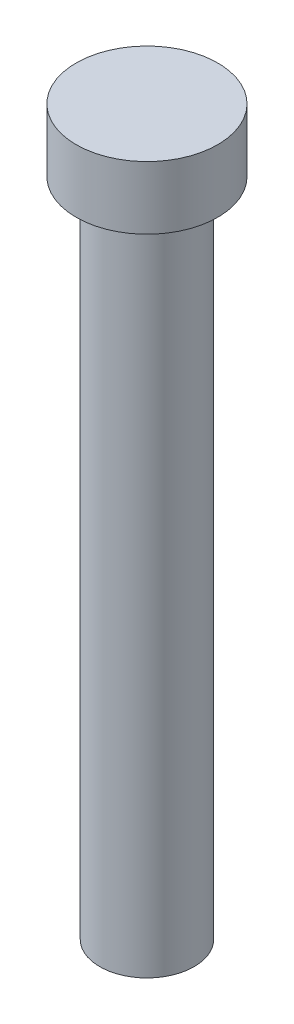
ISO-10303-21;
HEADER;
FILE_DESCRIPTION(('STEP AP214'),'2;1');
FILE_NAME('part.step','',(''),(''),'','','');
FILE_SCHEMA(('AUTOMOTIVE_DESIGN { 1 0 10303 214 1 1 1 1 }'));
ENDSEC;
DATA;
#1=APPLICATION_CONTEXT('core data for automotive mechanical design processes');
#2=APPLICATION_PROTOCOL_DEFINITION('international standard','automotive_design',2000,#1);
#3=PRODUCT_CONTEXT('',#1,'mechanical');
#4=PRODUCT('Part','Part','',(#3));
#5=PRODUCT_RELATED_PRODUCT_CATEGORY('part','',(#4));
#6=PRODUCT_DEFINITION_FORMATION('','',#4);
#7=PRODUCT_DEFINITION_CONTEXT('part definition',#1,'design');
#8=PRODUCT_DEFINITION('design','',#6,#7);
#9=PRODUCT_DEFINITION_SHAPE('','',#8);
#10=(LENGTH_UNIT() NAMED_UNIT(*) SI_UNIT(.MILLI.,.METRE.));
#11=(NAMED_UNIT(*) PLANE_ANGLE_UNIT() SI_UNIT($,.RADIAN.));
#12=(NAMED_UNIT(*) SI_UNIT($,.STERADIAN.) SOLID_ANGLE_UNIT());
#13=UNCERTAINTY_MEASURE_WITH_UNIT(LENGTH_MEASURE(1.E-05),#10,'distance_accuracy_value','');
#14=(GEOMETRIC_REPRESENTATION_CONTEXT(3) GLOBAL_UNCERTAINTY_ASSIGNED_CONTEXT((#13)) GLOBAL_UNIT_ASSIGNED_CONTEXT((#10,
#11,#12)) REPRESENTATION_CONTEXT('',''));
#15=CARTESIAN_POINT('',(0.,0.,0.));
#16=DIRECTION('',(0.,0.,1.));
#17=DIRECTION('',(1.,0.,0.));
#18=AXIS2_PLACEMENT_3D('',#15,#16,#17);
#19=CARTESIAN_POINT('',(0.,20.,0.));
#20=DIRECTION('',(0.,-1.,0.));
#21=DIRECTION('',(0.,0.,-1.));
#22=AXIS2_PLACEMENT_3D('',#19,#20,#21);
#23=CYLINDRICAL_SURFACE('',#22,22.5);
#24=CARTESIAN_POINT('',(0.,20.,0.));
#25=DIRECTION('',(0.,1.,0.));
#26=DIRECTION('',(0.,0.,1.));
#27=AXIS2_PLACEMENT_3D('',#24,#25,#26);
#28=CIRCLE('',#27,22.5);
#29=CARTESIAN_POINT('',(0.,20.,22.5));
#30=VERTEX_POINT('',#29);
#31=EDGE_CURVE('E38',#30,#30,#28,.T.);
#32=ORIENTED_EDGE('',*,*,#31,.F.);
#33=EDGE_LOOP('',(#32));
#34=FACE_BOUND('',#33,.T.);
#35=CARTESIAN_POINT('',(0.,0.,0.));
#36=DIRECTION('',(0.,1.,0.));
#37=DIRECTION('',(0.,0.,1.));
#38=AXIS2_PLACEMENT_3D('',#35,#36,#37);
#39=CIRCLE('',#38,22.5);
#40=CARTESIAN_POINT('',(0.,0.,22.5));
#41=VERTEX_POINT('',#40);
#42=EDGE_CURVE('E34',#41,#41,#39,.T.);
#43=ORIENTED_EDGE('',*,*,#42,.T.);
#44=EDGE_LOOP('',(#43));
#45=FACE_BOUND('',#44,.T.);
#46=ADVANCED_FACE('F31',(#34,#45),#23,.T.);
#47=CARTESIAN_POINT('',(0.,20.,0.));
#48=DIRECTION('',(0.,1.,0.));
#49=DIRECTION('',(0.,0.,1.));
#50=AXIS2_PLACEMENT_3D('',#47,#48,#49);
#51=PLANE('',#50);
#52=ORIENTED_EDGE('',*,*,#31,.T.);
#53=EDGE_LOOP('',(#52));
#54=FACE_BOUND('',#53,.T.);
#55=ADVANCED_FACE('F55',(#54),#51,.T.);
#56=CARTESIAN_POINT('',(0.,0.,0.));
#57=DIRECTION('',(0.,1.,0.));
#58=DIRECTION('',(0.,0.,1.));
#59=AXIS2_PLACEMENT_3D('',#56,#57,#58);
#60=PLANE('',#59);
#61=CARTESIAN_POINT('',(0.,0.,0.));
#62=DIRECTION('',(0.,-1.,0.));
#63=DIRECTION('',(0.,0.,-1.));
#64=AXIS2_PLACEMENT_3D('',#61,#62,#63);
#65=CIRCLE('',#64,15.);
#66=CARTESIAN_POINT('',(0.,0.,-15.));
#67=VERTEX_POINT('',#66);
#68=EDGE_CURVE('E10',#67,#67,#65,.T.);
#69=ORIENTED_EDGE('',*,*,#68,.F.);
#70=EDGE_LOOP('',(#69));
#71=FACE_BOUND('',#70,.T.);
#72=ORIENTED_EDGE('',*,*,#42,.F.);
#73=EDGE_LOOP('',(#72));
#74=FACE_BOUND('',#73,.T.);
#75=ADVANCED_FACE('F52',(#71,#74),#60,.F.);
#76=CARTESIAN_POINT('',(0.,-210.,0.));
#77=DIRECTION('',(0.,1.,0.));
#78=DIRECTION('',(0.,0.,1.));
#79=AXIS2_PLACEMENT_3D('',#76,#77,#78);
#80=CYLINDRICAL_SURFACE('',#79,15.);
#81=CARTESIAN_POINT('',(0.,-210.,0.));
#82=DIRECTION('',(0.,-1.,0.));
#83=DIRECTION('',(0.,0.,-1.));
#84=AXIS2_PLACEMENT_3D('',#81,#82,#83);
#85=CIRCLE('',#84,15.);
#86=CARTESIAN_POINT('',(0.,-210.,-15.));
#87=VERTEX_POINT('',#86);
#88=EDGE_CURVE('E44',#87,#87,#85,.T.);
#89=ORIENTED_EDGE('',*,*,#88,.F.);
#90=EDGE_LOOP('',(#89));
#91=FACE_BOUND('',#90,.T.);
#92=ORIENTED_EDGE('',*,*,#68,.T.);
#93=EDGE_LOOP('',(#92));
#94=FACE_BOUND('',#93,.T.);
#95=ADVANCED_FACE('F54',(#91,#94),#80,.T.);
#96=CARTESIAN_POINT('',(0.,-210.,0.));
#97=DIRECTION('',(0.,-1.,0.));
#98=DIRECTION('',(0.,0.,-1.));
#99=AXIS2_PLACEMENT_3D('',#96,#97,#98);
#100=PLANE('',#99);
#101=ORIENTED_EDGE('',*,*,#88,.T.);
#102=EDGE_LOOP('',(#101));
#103=FACE_BOUND('',#102,.T.);
#104=ADVANCED_FACE('F61',(#103),#100,.T.);
#105=CLOSED_SHELL('',(#46,#55,#75,#95,#104));
#106=MANIFOLD_SOLID_BREP('B2',#105);
#107=ADVANCED_BREP_SHAPE_REPRESENTATION('',(#18,#106),#14);
#108=SHAPE_DEFINITION_REPRESENTATION(#9,#107);
ENDSEC;
END-ISO-10303-21;
